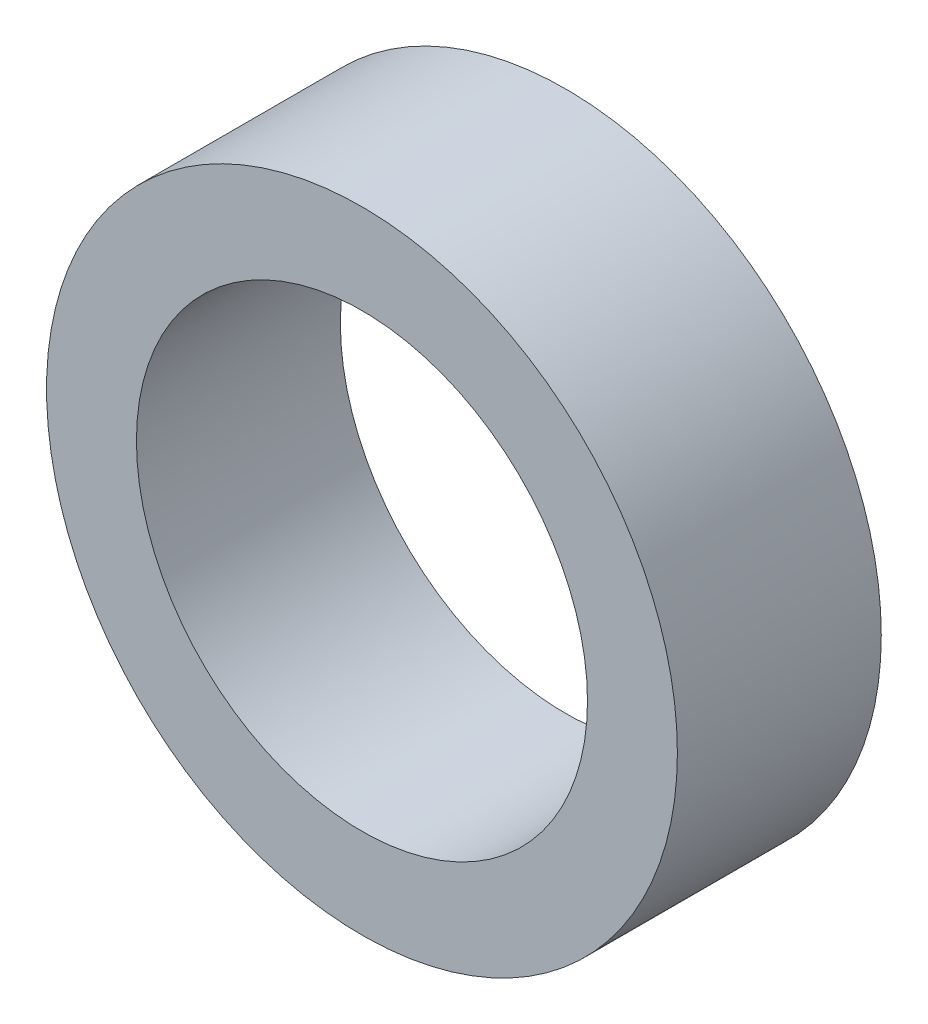
ISO-10303-21;
HEADER;
FILE_DESCRIPTION(('STEP AP214'),'2;1');
FILE_NAME('part.step','',(''),(''),'','','');
FILE_SCHEMA(('AUTOMOTIVE_DESIGN { 1 0 10303 214 1 1 1 1 }'));
ENDSEC;
DATA;
#1=APPLICATION_CONTEXT('core data for automotive mechanical design processes');
#2=APPLICATION_PROTOCOL_DEFINITION('international standard','automotive_design',2000,#1);
#3=PRODUCT_CONTEXT('',#1,'mechanical');
#4=PRODUCT('Part','Part','',(#3));
#5=PRODUCT_RELATED_PRODUCT_CATEGORY('part','',(#4));
#6=PRODUCT_DEFINITION_FORMATION('','',#4);
#7=PRODUCT_DEFINITION_CONTEXT('part definition',#1,'design');
#8=PRODUCT_DEFINITION('design','',#6,#7);
#9=PRODUCT_DEFINITION_SHAPE('','',#8);
#10=(LENGTH_UNIT() NAMED_UNIT(*) SI_UNIT(.MILLI.,.METRE.));
#11=(NAMED_UNIT(*) PLANE_ANGLE_UNIT() SI_UNIT($,.RADIAN.));
#12=(NAMED_UNIT(*) SI_UNIT($,.STERADIAN.) SOLID_ANGLE_UNIT());
#13=UNCERTAINTY_MEASURE_WITH_UNIT(LENGTH_MEASURE(1.E-05),#10,'distance_accuracy_value','');
#14=(GEOMETRIC_REPRESENTATION_CONTEXT(3) GLOBAL_UNCERTAINTY_ASSIGNED_CONTEXT((#13)) GLOBAL_UNIT_ASSIGNED_CONTEXT((#10,
#11,#12)) REPRESENTATION_CONTEXT('',''));
#15=CARTESIAN_POINT('',(0.,0.,0.));
#16=DIRECTION('',(0.,0.,1.));
#17=DIRECTION('',(1.,0.,0.));
#18=AXIS2_PLACEMENT_3D('',#15,#16,#17);
#19=CARTESIAN_POINT('',(0.,0.,3.59156));
#20=DIRECTION('',(0.,0.,1.));
#21=DIRECTION('',(1.,0.,0.));
#22=AXIS2_PLACEMENT_3D('',#19,#20,#21);
#23=PLANE('',#22);
#24=CARTESIAN_POINT('',(0.,0.,3.59156));
#25=DIRECTION('',(0.,0.,1.));
#26=DIRECTION('',(1.,0.,0.));
#27=AXIS2_PLACEMENT_3D('',#24,#25,#26);
#28=CIRCLE('',#27,5.55625);
#29=CARTESIAN_POINT('',(5.55625,0.,3.59156));
#30=VERTEX_POINT('',#29);
#31=EDGE_CURVE('E10',#30,#30,#28,.T.);
#32=ORIENTED_EDGE('',*,*,#31,.T.);
#33=EDGE_LOOP('',(#32));
#34=FACE_BOUND('',#33,.T.);
#35=CARTESIAN_POINT('',(0.,0.,3.59156));
#36=DIRECTION('',(0.,0.,1.));
#37=DIRECTION('',(1.,0.,0.));
#38=AXIS2_PLACEMENT_3D('',#35,#36,#37);
#39=CIRCLE('',#38,3.97256);
#40=CARTESIAN_POINT('',(3.97256,0.,3.59156));
#41=VERTEX_POINT('',#40);
#42=EDGE_CURVE('E56',#41,#41,#39,.T.);
#43=ORIENTED_EDGE('',*,*,#42,.F.);
#44=EDGE_LOOP('',(#43));
#45=FACE_BOUND('',#44,.T.);
#46=ADVANCED_FACE('F43',(#34,#45),#23,.T.);
#47=CARTESIAN_POINT('',(0.,0.,0.));
#48=DIRECTION('',(0.,0.,1.));
#49=DIRECTION('',(1.,0.,0.));
#50=AXIS2_PLACEMENT_3D('',#47,#48,#49);
#51=PLANE('',#50);
#52=CARTESIAN_POINT('',(0.,0.,0.));
#53=DIRECTION('',(0.,0.,1.));
#54=DIRECTION('',(1.,0.,0.));
#55=AXIS2_PLACEMENT_3D('',#52,#53,#54);
#56=CIRCLE('',#55,5.55625);
#57=CARTESIAN_POINT('',(5.55625,0.,0.));
#58=VERTEX_POINT('',#57);
#59=EDGE_CURVE('E47',#58,#58,#56,.T.);
#60=ORIENTED_EDGE('',*,*,#59,.F.);
#61=EDGE_LOOP('',(#60));
#62=FACE_BOUND('',#61,.T.);
#63=CARTESIAN_POINT('',(0.,0.,0.));
#64=DIRECTION('',(0.,0.,1.));
#65=DIRECTION('',(1.,0.,0.));
#66=AXIS2_PLACEMENT_3D('',#63,#64,#65);
#67=CIRCLE('',#66,3.97256);
#68=CARTESIAN_POINT('',(3.97256,0.,0.));
#69=VERTEX_POINT('',#68);
#70=EDGE_CURVE('E58',#69,#69,#67,.T.);
#71=ORIENTED_EDGE('',*,*,#70,.T.);
#72=EDGE_LOOP('',(#71));
#73=FACE_BOUND('',#72,.T.);
#74=ADVANCED_FACE('F70',(#62,#73),#51,.F.);
#75=CARTESIAN_POINT('',(0.,0.,3.59156));
#76=DIRECTION('',(0.,0.,-1.));
#77=DIRECTION('',(-1.,0.,0.));
#78=AXIS2_PLACEMENT_3D('',#75,#76,#77);
#79=CYLINDRICAL_SURFACE('',#78,5.55625);
#80=ORIENTED_EDGE('',*,*,#31,.F.);
#81=EDGE_LOOP('',(#80));
#82=FACE_BOUND('',#81,.T.);
#83=ORIENTED_EDGE('',*,*,#59,.T.);
#84=EDGE_LOOP('',(#83));
#85=FACE_BOUND('',#84,.T.);
#86=ADVANCED_FACE('F45',(#82,#85),#79,.T.);
#87=CARTESIAN_POINT('',(0.,0.,3.59156));
#88=DIRECTION('',(0.,0.,-1.));
#89=DIRECTION('',(-1.,0.,0.));
#90=AXIS2_PLACEMENT_3D('',#87,#88,#89);
#91=CYLINDRICAL_SURFACE('',#90,3.97256);
#92=ORIENTED_EDGE('',*,*,#42,.T.);
#93=EDGE_LOOP('',(#92));
#94=FACE_BOUND('',#93,.T.);
#95=ORIENTED_EDGE('',*,*,#70,.F.);
#96=EDGE_LOOP('',(#95));
#97=FACE_BOUND('',#96,.T.);
#98=ADVANCED_FACE('F66',(#94,#97),#91,.F.);
#99=CLOSED_SHELL('',(#46,#74,#86,#98));
#100=MANIFOLD_SOLID_BREP('B2',#99);
#101=ADVANCED_BREP_SHAPE_REPRESENTATION('',(#18,#100),#14);
#102=SHAPE_DEFINITION_REPRESENTATION(#9,#101);
ENDSEC;
END-ISO-10303-21;
